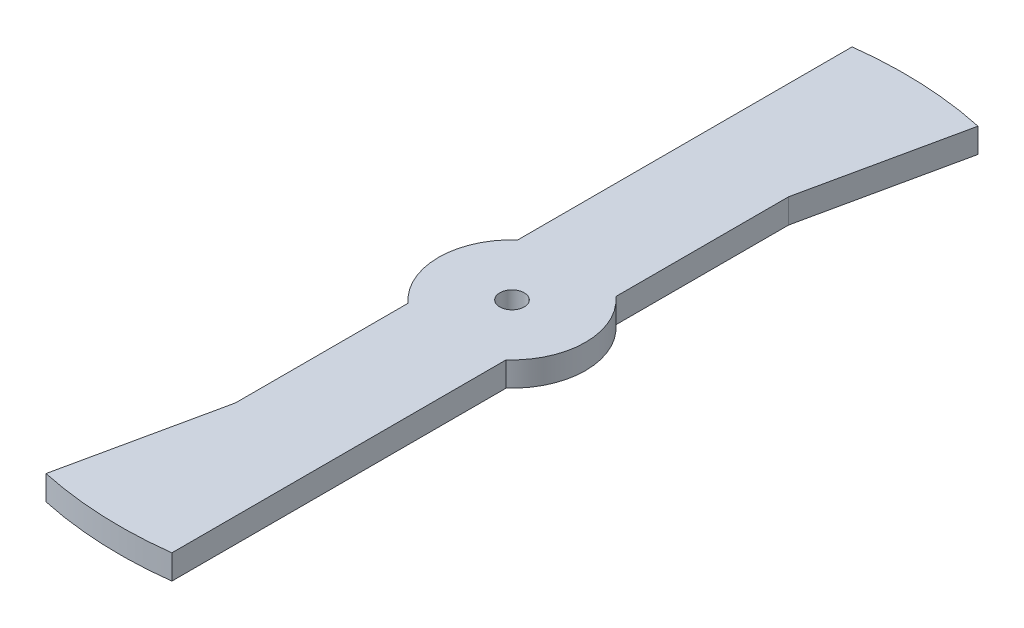
ISO-10303-21;
HEADER;
FILE_DESCRIPTION(('STEP AP214'),'2;1');
FILE_NAME('part.step','',(''),(''),'','','');
FILE_SCHEMA(('AUTOMOTIVE_DESIGN { 1 0 10303 214 1 1 1 1 }'));
ENDSEC;
DATA;
#1=APPLICATION_CONTEXT('core data for automotive mechanical design processes');
#2=APPLICATION_PROTOCOL_DEFINITION('international standard','automotive_design',2000,#1);
#3=PRODUCT_CONTEXT('',#1,'mechanical');
#4=PRODUCT('Part','Part','',(#3));
#5=PRODUCT_RELATED_PRODUCT_CATEGORY('part','',(#4));
#6=PRODUCT_DEFINITION_FORMATION('','',#4);
#7=PRODUCT_DEFINITION_CONTEXT('part definition',#1,'design');
#8=PRODUCT_DEFINITION('design','',#6,#7);
#9=PRODUCT_DEFINITION_SHAPE('','',#8);
#10=(LENGTH_UNIT() NAMED_UNIT(*) SI_UNIT(.MILLI.,.METRE.));
#11=(NAMED_UNIT(*) PLANE_ANGLE_UNIT() SI_UNIT($,.RADIAN.));
#12=(NAMED_UNIT(*) SI_UNIT($,.STERADIAN.) SOLID_ANGLE_UNIT());
#13=UNCERTAINTY_MEASURE_WITH_UNIT(LENGTH_MEASURE(1.E-05),#10,'distance_accuracy_value','');
#14=(GEOMETRIC_REPRESENTATION_CONTEXT(3) GLOBAL_UNCERTAINTY_ASSIGNED_CONTEXT((#13)) GLOBAL_UNIT_ASSIGNED_CONTEXT((#10,
#11,#12)) REPRESENTATION_CONTEXT('',''));
#15=CARTESIAN_POINT('',(0.,0.,0.));
#16=DIRECTION('',(0.,0.,1.));
#17=DIRECTION('',(1.,0.,0.));
#18=AXIS2_PLACEMENT_3D('',#15,#16,#17);
#19=CARTESIAN_POINT('',(0.,6.35,0.));
#20=DIRECTION('',(0.,-1.,0.));
#21=DIRECTION('',(0.,0.,-1.));
#22=AXIS2_PLACEMENT_3D('',#19,#20,#21);
#23=CYLINDRICAL_SURFACE('',#22,19.05);
#24=CARTESIAN_POINT('',(0.,0.,0.));
#25=DIRECTION('',(0.,1.,0.));
#26=DIRECTION('',(0.,0.,1.));
#27=AXIS2_PLACEMENT_3D('',#24,#25,#26);
#28=CIRCLE('',#27,19.05);
#29=CARTESIAN_POINT('',(12.7,0.,-14.1990316571237));
#30=VERTEX_POINT('',#29);
#31=CARTESIAN_POINT('',(12.7,0.,14.1990316571237));
#32=VERTEX_POINT('',#31);
#33=EDGE_CURVE('E145',#30,#32,#28,.F.);
#34=ORIENTED_EDGE('',*,*,#33,.F.);
#35=DIRECTION('',(0.,-1.,0.));
#36=VECTOR('',#35,1.);
#37=CARTESIAN_POINT('',(12.7,6.35,-14.1990316571237));
#38=LINE('',#37,#36);
#39=CARTESIAN_POINT('',(12.7,6.35,-14.1990316571237));
#40=VERTEX_POINT('',#39);
#41=EDGE_CURVE('E11',#40,#30,#38,.T.);
#42=ORIENTED_EDGE('',*,*,#41,.F.);
#43=CARTESIAN_POINT('',(0.,6.35,0.));
#44=DIRECTION('',(0.,1.,0.));
#45=DIRECTION('',(0.,0.,1.));
#46=AXIS2_PLACEMENT_3D('',#43,#44,#45);
#47=CIRCLE('',#46,19.05);
#48=CARTESIAN_POINT('',(12.7,6.35,14.1990316571237));
#49=VERTEX_POINT('',#48);
#50=EDGE_CURVE('E170',#40,#49,#47,.F.);
#51=ORIENTED_EDGE('',*,*,#50,.T.);
#52=DIRECTION('',(0.,-1.,0.));
#53=VECTOR('',#52,1.);
#54=CARTESIAN_POINT('',(12.7,6.35,14.1990316571237));
#55=LINE('',#54,#53);
#56=EDGE_CURVE('E91',#49,#32,#55,.T.);
#57=ORIENTED_EDGE('',*,*,#56,.T.);
#58=EDGE_LOOP('',(#34,#42,#51,#57));
#59=FACE_BOUND('',#58,.T.);
#60=ADVANCED_FACE('F35',(#59),#23,.T.);
#61=CARTESIAN_POINT('',(12.7,6.35,0.));
#62=DIRECTION('',(-1.,0.,0.));
#63=DIRECTION('',(0.,0.,1.));
#64=AXIS2_PLACEMENT_3D('',#61,#62,#63);
#65=PLANE('',#64);
#66=DIRECTION('',(0.,0.,-1.));
#67=VECTOR('',#66,1.);
#68=CARTESIAN_POINT('',(12.7,0.,0.));
#69=LINE('',#68,#67);
#70=CARTESIAN_POINT('',(12.7,0.,-58.9730075966963));
#71=VERTEX_POINT('',#70);
#72=EDGE_CURVE('E148',#30,#71,#69,.T.);
#73=ORIENTED_EDGE('',*,*,#72,.T.);
#74=DIRECTION('',(0.,-1.,0.));
#75=VECTOR('',#74,1.);
#76=CARTESIAN_POINT('',(12.7,6.35,-58.9730075966963));
#77=LINE('',#76,#75);
#78=CARTESIAN_POINT('',(12.7,6.35,-58.9730075966963));
#79=VERTEX_POINT('',#78);
#80=EDGE_CURVE('E43',#79,#71,#77,.T.);
#81=ORIENTED_EDGE('',*,*,#80,.F.);
#82=DIRECTION('',(0.,0.,-1.));
#83=VECTOR('',#82,1.);
#84=CARTESIAN_POINT('',(12.7,6.35,0.));
#85=LINE('',#84,#83);
#86=EDGE_CURVE('E209',#40,#79,#85,.T.);
#87=ORIENTED_EDGE('',*,*,#86,.F.);
#88=ORIENTED_EDGE('',*,*,#41,.T.);
#89=EDGE_LOOP('',(#73,#81,#87,#88));
#90=FACE_BOUND('',#89,.T.);
#91=ADVANCED_FACE('F223',(#90),#65,.F.);
#92=CARTESIAN_POINT('',(0.,6.35,0.));
#93=DIRECTION('',(-0.9775881905793,0.,-0.210526315789474));
#94=DIRECTION('',(-0.210526315789474,0.,0.977588190579301));
#95=AXIS2_PLACEMENT_3D('',#92,#93,#94);
#96=PLANE('',#95);
#97=DIRECTION('',(0.210526315789474,0.,-0.977588190579301));
#98=VECTOR('',#97,1.);
#99=CARTESIAN_POINT('',(0.,0.,0.));
#100=LINE('',#99,#98);
#101=CARTESIAN_POINT('',(21.3894736842105,0.,-99.3229601628569));
#102=VERTEX_POINT('',#101);
#103=EDGE_CURVE('E150',#71,#102,#100,.T.);
#104=ORIENTED_EDGE('',*,*,#103,.T.);
#105=DIRECTION('',(0.,-1.,0.));
#106=VECTOR('',#105,1.);
#107=CARTESIAN_POINT('',(21.3894736842105,6.35,-99.3229601628569));
#108=LINE('',#107,#106);
#109=CARTESIAN_POINT('',(21.3894736842105,6.35,-99.3229601628569));
#110=VERTEX_POINT('',#109);
#111=EDGE_CURVE('E182',#110,#102,#108,.T.);
#112=ORIENTED_EDGE('',*,*,#111,.F.);
#113=DIRECTION('',(0.210526315789474,0.,-0.977588190579301));
#114=VECTOR('',#113,1.);
#115=CARTESIAN_POINT('',(0.,6.35,0.));
#116=LINE('',#115,#114);
#117=EDGE_CURVE('E190',#79,#110,#116,.T.);
#118=ORIENTED_EDGE('',*,*,#117,.F.);
#119=ORIENTED_EDGE('',*,*,#80,.T.);
#120=EDGE_LOOP('',(#104,#112,#118,#119));
#121=FACE_BOUND('',#120,.T.);
#122=ADVANCED_FACE('F188',(#121),#96,.F.);
#123=CARTESIAN_POINT('',(0.,6.35,0.));
#124=DIRECTION('',(0.,-1.,0.));
#125=DIRECTION('',(0.,0.,-1.));
#126=AXIS2_PLACEMENT_3D('',#123,#124,#125);
#127=CYLINDRICAL_SURFACE('',#126,101.6);
#128=CARTESIAN_POINT('',(0.,0.,0.));
#129=DIRECTION('',(0.,1.,0.));
#130=DIRECTION('',(0.,0.,1.));
#131=AXIS2_PLACEMENT_3D('',#128,#129,#130);
#132=CIRCLE('',#131,101.6);
#133=CARTESIAN_POINT('',(-12.7,0.,-100.803124951561));
#134=VERTEX_POINT('',#133);
#135=EDGE_CURVE('E153',#134,#102,#132,.F.);
#136=ORIENTED_EDGE('',*,*,#135,.F.);
#137=DIRECTION('',(0.,-1.,0.));
#138=VECTOR('',#137,1.);
#139=CARTESIAN_POINT('',(-12.7,6.35,-100.803124951561));
#140=LINE('',#139,#138);
#141=CARTESIAN_POINT('',(-12.7,6.35,-100.803124951561));
#142=VERTEX_POINT('',#141);
#143=EDGE_CURVE('E180',#142,#134,#140,.T.);
#144=ORIENTED_EDGE('',*,*,#143,.F.);
#145=CARTESIAN_POINT('',(0.,6.35,0.));
#146=DIRECTION('',(0.,1.,0.));
#147=DIRECTION('',(0.,0.,1.));
#148=AXIS2_PLACEMENT_3D('',#145,#146,#147);
#149=CIRCLE('',#148,101.6);
#150=EDGE_CURVE('E204',#142,#110,#149,.F.);
#151=ORIENTED_EDGE('',*,*,#150,.T.);
#152=ORIENTED_EDGE('',*,*,#111,.T.);
#153=EDGE_LOOP('',(#136,#144,#151,#152));
#154=FACE_BOUND('',#153,.T.);
#155=ADVANCED_FACE('F200',(#154),#127,.T.);
#156=CARTESIAN_POINT('',(-12.7,6.35,0.));
#157=DIRECTION('',(1.,0.,0.));
#158=DIRECTION('',(0.,0.,-1.));
#159=AXIS2_PLACEMENT_3D('',#156,#157,#158);
#160=PLANE('',#159);
#161=DIRECTION('',(0.,0.,1.));
#162=VECTOR('',#161,1.);
#163=CARTESIAN_POINT('',(-12.7,0.,0.));
#164=LINE('',#163,#162);
#165=CARTESIAN_POINT('',(-12.7,0.,-14.1990316571237));
#166=VERTEX_POINT('',#165);
#167=EDGE_CURVE('E156',#134,#166,#164,.T.);
#168=ORIENTED_EDGE('',*,*,#167,.T.);
#169=DIRECTION('',(0.,-1.,0.));
#170=VECTOR('',#169,1.);
#171=CARTESIAN_POINT('',(-12.7,6.35,-14.1990316571237));
#172=LINE('',#171,#170);
#173=CARTESIAN_POINT('',(-12.7,6.35,-14.1990316571237));
#174=VERTEX_POINT('',#173);
#175=EDGE_CURVE('E177',#174,#166,#172,.T.);
#176=ORIENTED_EDGE('',*,*,#175,.F.);
#177=DIRECTION('',(0.,0.,1.));
#178=VECTOR('',#177,1.);
#179=CARTESIAN_POINT('',(-12.7,6.35,0.));
#180=LINE('',#179,#178);
#181=EDGE_CURVE('E205',#142,#174,#180,.T.);
#182=ORIENTED_EDGE('',*,*,#181,.F.);
#183=ORIENTED_EDGE('',*,*,#143,.T.);
#184=EDGE_LOOP('',(#168,#176,#182,#183));
#185=FACE_BOUND('',#184,.T.);
#186=ADVANCED_FACE('F233',(#185),#160,.F.);
#187=CARTESIAN_POINT('',(0.,6.35,0.));
#188=DIRECTION('',(0.,-1.,0.));
#189=DIRECTION('',(0.,0.,-1.));
#190=AXIS2_PLACEMENT_3D('',#187,#188,#189);
#191=CYLINDRICAL_SURFACE('',#190,19.05);
#192=CARTESIAN_POINT('',(0.,0.,0.));
#193=DIRECTION('',(0.,1.,0.));
#194=DIRECTION('',(0.,0.,1.));
#195=AXIS2_PLACEMENT_3D('',#192,#193,#194);
#196=CIRCLE('',#195,19.05);
#197=CARTESIAN_POINT('',(-12.7,0.,14.1990316571237));
#198=VERTEX_POINT('',#197);
#199=EDGE_CURVE('E158',#166,#198,#196,.T.);
#200=ORIENTED_EDGE('',*,*,#199,.T.);
#201=DIRECTION('',(0.,-1.,0.));
#202=VECTOR('',#201,1.);
#203=CARTESIAN_POINT('',(-12.7,6.35,14.1990316571237));
#204=LINE('',#203,#202);
#205=CARTESIAN_POINT('',(-12.7,6.35,14.1990316571237));
#206=VERTEX_POINT('',#205);
#207=EDGE_CURVE('E174',#206,#198,#204,.T.);
#208=ORIENTED_EDGE('',*,*,#207,.F.);
#209=CARTESIAN_POINT('',(0.,6.35,0.));
#210=DIRECTION('',(0.,1.,0.));
#211=DIRECTION('',(0.,0.,1.));
#212=AXIS2_PLACEMENT_3D('',#209,#210,#211);
#213=CIRCLE('',#212,19.05);
#214=EDGE_CURVE('E207',#174,#206,#213,.T.);
#215=ORIENTED_EDGE('',*,*,#214,.F.);
#216=ORIENTED_EDGE('',*,*,#175,.T.);
#217=EDGE_LOOP('',(#200,#208,#215,#216));
#218=FACE_BOUND('',#217,.T.);
#219=ADVANCED_FACE('F217',(#218),#191,.T.);
#220=CARTESIAN_POINT('',(-12.7,6.35,0.));
#221=DIRECTION('',(1.,0.,0.));
#222=DIRECTION('',(0.,0.,-1.));
#223=AXIS2_PLACEMENT_3D('',#220,#221,#222);
#224=PLANE('',#223);
#225=DIRECTION('',(0.,0.,1.));
#226=VECTOR('',#225,1.);
#227=CARTESIAN_POINT('',(-12.7,0.,0.));
#228=LINE('',#227,#226);
#229=CARTESIAN_POINT('',(-12.7,0.,58.9730075966963));
#230=VERTEX_POINT('',#229);
#231=EDGE_CURVE('E160',#198,#230,#228,.T.);
#232=ORIENTED_EDGE('',*,*,#231,.T.);
#233=DIRECTION('',(0.,-1.,0.));
#234=VECTOR('',#233,1.);
#235=CARTESIAN_POINT('',(-12.7,6.35,58.9730075966963));
#236=LINE('',#235,#234);
#237=CARTESIAN_POINT('',(-12.7,6.35,58.9730075966963));
#238=VERTEX_POINT('',#237);
#239=EDGE_CURVE('E135',#238,#230,#236,.T.);
#240=ORIENTED_EDGE('',*,*,#239,.F.);
#241=DIRECTION('',(0.,0.,1.));
#242=VECTOR('',#241,1.);
#243=CARTESIAN_POINT('',(-12.7,6.35,0.));
#244=LINE('',#243,#242);
#245=EDGE_CURVE('E122',#206,#238,#244,.T.);
#246=ORIENTED_EDGE('',*,*,#245,.F.);
#247=ORIENTED_EDGE('',*,*,#207,.T.);
#248=EDGE_LOOP('',(#232,#240,#246,#247));
#249=FACE_BOUND('',#248,.T.);
#250=ADVANCED_FACE('F220',(#249),#224,.F.);
#251=CARTESIAN_POINT('',(0.,6.35,0.));
#252=DIRECTION('',(0.9775881905793,0.,0.210526315789474));
#253=DIRECTION('',(0.210526315789474,0.,-0.977588190579301));
#254=AXIS2_PLACEMENT_3D('',#251,#252,#253);
#255=PLANE('',#254);
#256=DIRECTION('',(-0.210526315789474,0.,0.977588190579301));
#257=VECTOR('',#256,1.);
#258=CARTESIAN_POINT('',(0.,0.,0.));
#259=LINE('',#258,#257);
#260=CARTESIAN_POINT('',(-21.3894736842105,0.,99.3229601628569));
#261=VERTEX_POINT('',#260);
#262=EDGE_CURVE('E131',#230,#261,#259,.T.);
#263=ORIENTED_EDGE('',*,*,#262,.T.);
#264=DIRECTION('',(0.,-1.,0.));
#265=VECTOR('',#264,1.);
#266=CARTESIAN_POINT('',(-21.3894736842105,6.35,99.3229601628569));
#267=LINE('',#266,#265);
#268=CARTESIAN_POINT('',(-21.3894736842105,6.35,99.3229601628569));
#269=VERTEX_POINT('',#268);
#270=EDGE_CURVE('E128',#269,#261,#267,.T.);
#271=ORIENTED_EDGE('',*,*,#270,.F.);
#272=DIRECTION('',(-0.210526315789474,0.,0.977588190579301));
#273=VECTOR('',#272,1.);
#274=CARTESIAN_POINT('',(0.,6.35,0.));
#275=LINE('',#274,#273);
#276=EDGE_CURVE('E115',#238,#269,#275,.T.);
#277=ORIENTED_EDGE('',*,*,#276,.F.);
#278=ORIENTED_EDGE('',*,*,#239,.T.);
#279=EDGE_LOOP('',(#263,#271,#277,#278));
#280=FACE_BOUND('',#279,.T.);
#281=ADVANCED_FACE('F129',(#280),#255,.F.);
#282=CARTESIAN_POINT('',(0.,6.35,0.));
#283=DIRECTION('',(0.,-1.,0.));
#284=DIRECTION('',(0.,0.,-1.));
#285=AXIS2_PLACEMENT_3D('',#282,#283,#284);
#286=CYLINDRICAL_SURFACE('',#285,101.6);
#287=CARTESIAN_POINT('',(0.,0.,0.));
#288=DIRECTION('',(0.,1.,0.));
#289=DIRECTION('',(0.,0.,1.));
#290=AXIS2_PLACEMENT_3D('',#287,#288,#289);
#291=CIRCLE('',#290,101.6);
#292=CARTESIAN_POINT('',(12.7,0.,100.803124951561));
#293=VERTEX_POINT('',#292);
#294=EDGE_CURVE('E163',#293,#261,#291,.F.);
#295=ORIENTED_EDGE('',*,*,#294,.F.);
#296=DIRECTION('',(0.,-1.,0.));
#297=VECTOR('',#296,1.);
#298=CARTESIAN_POINT('',(12.7,6.35,100.803124951561));
#299=LINE('',#298,#297);
#300=CARTESIAN_POINT('',(12.7,6.35,100.803124951561));
#301=VERTEX_POINT('',#300);
#302=EDGE_CURVE('E84',#301,#293,#299,.T.);
#303=ORIENTED_EDGE('',*,*,#302,.F.);
#304=CARTESIAN_POINT('',(0.,6.35,0.));
#305=DIRECTION('',(0.,1.,0.));
#306=DIRECTION('',(0.,0.,1.));
#307=AXIS2_PLACEMENT_3D('',#304,#305,#306);
#308=CIRCLE('',#307,101.6);
#309=EDGE_CURVE('E120',#301,#269,#308,.F.);
#310=ORIENTED_EDGE('',*,*,#309,.T.);
#311=ORIENTED_EDGE('',*,*,#270,.T.);
#312=EDGE_LOOP('',(#295,#303,#310,#311));
#313=FACE_BOUND('',#312,.T.);
#314=ADVANCED_FACE('F137',(#313),#286,.T.);
#315=CARTESIAN_POINT('',(12.7,6.35,0.));
#316=DIRECTION('',(-1.,0.,0.));
#317=DIRECTION('',(0.,0.,1.));
#318=AXIS2_PLACEMENT_3D('',#315,#316,#317);
#319=PLANE('',#318);
#320=DIRECTION('',(0.,0.,-1.));
#321=VECTOR('',#320,1.);
#322=CARTESIAN_POINT('',(12.7,0.,0.));
#323=LINE('',#322,#321);
#324=EDGE_CURVE('E165',#293,#32,#323,.T.);
#325=ORIENTED_EDGE('',*,*,#324,.T.);
#326=ORIENTED_EDGE('',*,*,#56,.F.);
#327=DIRECTION('',(0.,0.,-1.));
#328=VECTOR('',#327,1.);
#329=CARTESIAN_POINT('',(12.7,6.35,0.));
#330=LINE('',#329,#328);
#331=EDGE_CURVE('E51',#301,#49,#330,.T.);
#332=ORIENTED_EDGE('',*,*,#331,.F.);
#333=ORIENTED_EDGE('',*,*,#302,.T.);
#334=EDGE_LOOP('',(#325,#326,#332,#333));
#335=FACE_BOUND('',#334,.T.);
#336=ADVANCED_FACE('F221',(#335),#319,.F.);
#337=CARTESIAN_POINT('',(0.,6.35,0.));
#338=DIRECTION('',(0.,-1.,0.));
#339=DIRECTION('',(0.,0.,-1.));
#340=AXIS2_PLACEMENT_3D('',#337,#338,#339);
#341=CYLINDRICAL_SURFACE('',#340,3.175);
#342=CARTESIAN_POINT('',(0.,6.35,0.));
#343=DIRECTION('',(0.,1.,0.));
#344=DIRECTION('',(0.,0.,1.));
#345=AXIS2_PLACEMENT_3D('',#342,#343,#344);
#346=CIRCLE('',#345,3.175);
#347=CARTESIAN_POINT('',(0.,6.35,3.175));
#348=VERTEX_POINT('',#347);
#349=EDGE_CURVE('E139',#348,#348,#346,.T.);
#350=ORIENTED_EDGE('',*,*,#349,.T.);
#351=EDGE_LOOP('',(#350));
#352=FACE_BOUND('',#351,.T.);
#353=CARTESIAN_POINT('',(0.,0.,0.));
#354=DIRECTION('',(0.,1.,0.));
#355=DIRECTION('',(0.,0.,1.));
#356=AXIS2_PLACEMENT_3D('',#353,#354,#355);
#357=CIRCLE('',#356,3.175);
#358=CARTESIAN_POINT('',(0.,0.,3.175));
#359=VERTEX_POINT('',#358);
#360=EDGE_CURVE('E167',#359,#359,#357,.T.);
#361=ORIENTED_EDGE('',*,*,#360,.F.);
#362=EDGE_LOOP('',(#361));
#363=FACE_BOUND('',#362,.T.);
#364=ADVANCED_FACE('F247',(#352,#363),#341,.F.);
#365=CARTESIAN_POINT('',(0.,6.35,0.));
#366=DIRECTION('',(0.,1.,0.));
#367=DIRECTION('',(0.,0.,1.));
#368=AXIS2_PLACEMENT_3D('',#365,#366,#367);
#369=PLANE('',#368);
#370=ORIENTED_EDGE('',*,*,#50,.F.);
#371=ORIENTED_EDGE('',*,*,#86,.T.);
#372=ORIENTED_EDGE('',*,*,#117,.T.);
#373=ORIENTED_EDGE('',*,*,#150,.F.);
#374=ORIENTED_EDGE('',*,*,#181,.T.);
#375=ORIENTED_EDGE('',*,*,#214,.T.);
#376=ORIENTED_EDGE('',*,*,#245,.T.);
#377=ORIENTED_EDGE('',*,*,#276,.T.);
#378=ORIENTED_EDGE('',*,*,#309,.F.);
#379=ORIENTED_EDGE('',*,*,#331,.T.);
#380=EDGE_LOOP('',(#370,#371,#372,#373,#374,#375,#376,#377,#378,#379));
#381=FACE_BOUND('',#380,.T.);
#382=ORIENTED_EDGE('',*,*,#349,.F.);
#383=EDGE_LOOP('',(#382));
#384=FACE_BOUND('',#383,.T.);
#385=ADVANCED_FACE('F117',(#381,#384),#369,.T.);
#386=CARTESIAN_POINT('',(0.,0.,0.));
#387=DIRECTION('',(0.,1.,0.));
#388=DIRECTION('',(0.,0.,1.));
#389=AXIS2_PLACEMENT_3D('',#386,#387,#388);
#390=PLANE('',#389);
#391=ORIENTED_EDGE('',*,*,#33,.T.);
#392=ORIENTED_EDGE('',*,*,#324,.F.);
#393=ORIENTED_EDGE('',*,*,#294,.T.);
#394=ORIENTED_EDGE('',*,*,#262,.F.);
#395=ORIENTED_EDGE('',*,*,#231,.F.);
#396=ORIENTED_EDGE('',*,*,#199,.F.);
#397=ORIENTED_EDGE('',*,*,#167,.F.);
#398=ORIENTED_EDGE('',*,*,#135,.T.);
#399=ORIENTED_EDGE('',*,*,#103,.F.);
#400=ORIENTED_EDGE('',*,*,#72,.F.);
#401=EDGE_LOOP('',(#391,#392,#393,#394,#395,#396,#397,#398,#399,#400));
#402=FACE_BOUND('',#401,.T.);
#403=ORIENTED_EDGE('',*,*,#360,.T.);
#404=EDGE_LOOP('',(#403));
#405=FACE_BOUND('',#404,.T.);
#406=ADVANCED_FACE('F194',(#402,#405),#390,.F.);
#407=CLOSED_SHELL('',(#60,#91,#122,#155,#186,#219,#250,#281,#314,#336,#364,#385,#406));
#408=MANIFOLD_SOLID_BREP('B2',#407);
#409=ADVANCED_BREP_SHAPE_REPRESENTATION('',(#18,#408),#14);
#410=SHAPE_DEFINITION_REPRESENTATION(#9,#409);
ENDSEC;
END-ISO-10303-21;
